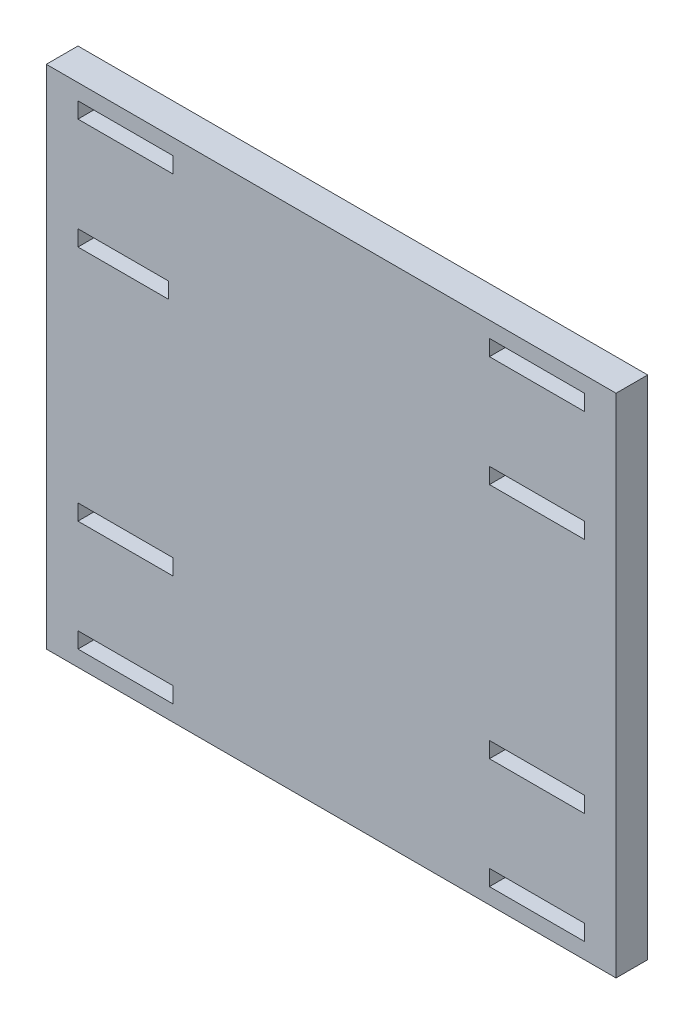
ISO-10303-21;
HEADER;
FILE_DESCRIPTION(('STEP AP214'),'2;1');
FILE_NAME('part.step','',(''),(''),'','','');
FILE_SCHEMA(('AUTOMOTIVE_DESIGN { 1 0 10303 214 1 1 1 1 }'));
ENDSEC;
DATA;
#1=APPLICATION_CONTEXT('core data for automotive mechanical design processes');
#2=APPLICATION_PROTOCOL_DEFINITION('international standard','automotive_design',2000,#1);
#3=PRODUCT_CONTEXT('',#1,'mechanical');
#4=PRODUCT('Part','Part','',(#3));
#5=PRODUCT_RELATED_PRODUCT_CATEGORY('part','',(#4));
#6=PRODUCT_DEFINITION_FORMATION('','',#4);
#7=PRODUCT_DEFINITION_CONTEXT('part definition',#1,'design');
#8=PRODUCT_DEFINITION('design','',#6,#7);
#9=PRODUCT_DEFINITION_SHAPE('','',#8);
#10=(LENGTH_UNIT() NAMED_UNIT(*) SI_UNIT(.MILLI.,.METRE.));
#11=(NAMED_UNIT(*) PLANE_ANGLE_UNIT() SI_UNIT($,.RADIAN.));
#12=(NAMED_UNIT(*) SI_UNIT($,.STERADIAN.) SOLID_ANGLE_UNIT());
#13=UNCERTAINTY_MEASURE_WITH_UNIT(LENGTH_MEASURE(1.E-05),#10,'distance_accuracy_value','');
#14=(GEOMETRIC_REPRESENTATION_CONTEXT(3) GLOBAL_UNCERTAINTY_ASSIGNED_CONTEXT((#13)) GLOBAL_UNIT_ASSIGNED_CONTEXT((#10,
#11,#12)) REPRESENTATION_CONTEXT('',''));
#15=CARTESIAN_POINT('',(0.,0.,0.));
#16=DIRECTION('',(0.,0.,1.));
#17=DIRECTION('',(1.,0.,0.));
#18=AXIS2_PLACEMENT_3D('',#15,#16,#17);
#19=CARTESIAN_POINT('',(90.,80.,10.));
#20=DIRECTION('',(-1.,0.,0.));
#21=DIRECTION('',(0.,-1.,0.));
#22=AXIS2_PLACEMENT_3D('',#19,#20,#21);
#23=PLANE('',#22);
#24=DIRECTION('',(0.,1.,0.));
#25=VECTOR('',#24,1.);
#26=CARTESIAN_POINT('',(90.,80.,0.));
#27=LINE('',#26,#25);
#28=CARTESIAN_POINT('',(90.,-80.,0.));
#29=VERTEX_POINT('',#28);
#30=CARTESIAN_POINT('',(90.,80.,0.));
#31=VERTEX_POINT('',#30);
#32=EDGE_CURVE('E617',#29,#31,#27,.T.);
#33=ORIENTED_EDGE('',*,*,#32,.T.);
#34=DIRECTION('',(0.,0.,-1.));
#35=VECTOR('',#34,1.);
#36=CARTESIAN_POINT('',(90.,80.,10.));
#37=LINE('',#36,#35);
#38=CARTESIAN_POINT('',(90.,80.,10.));
#39=VERTEX_POINT('',#38);
#40=EDGE_CURVE('E11',#39,#31,#37,.T.);
#41=ORIENTED_EDGE('',*,*,#40,.F.);
#42=DIRECTION('',(0.,1.,0.));
#43=VECTOR('',#42,1.);
#44=CARTESIAN_POINT('',(90.,80.,10.));
#45=LINE('',#44,#43);
#46=CARTESIAN_POINT('',(90.,-80.,10.));
#47=VERTEX_POINT('',#46);
#48=EDGE_CURVE('E626',#47,#39,#45,.T.);
#49=ORIENTED_EDGE('',*,*,#48,.F.);
#50=DIRECTION('',(0.,0.,-1.));
#51=VECTOR('',#50,1.);
#52=CARTESIAN_POINT('',(90.,-80.,10.));
#53=LINE('',#52,#51);
#54=EDGE_CURVE('E641',#47,#29,#53,.T.);
#55=ORIENTED_EDGE('',*,*,#54,.T.);
#56=EDGE_LOOP('',(#33,#41,#49,#55));
#57=FACE_BOUND('',#56,.T.);
#58=ADVANCED_FACE('F42',(#57),#23,.F.);
#59=CARTESIAN_POINT('',(-90.,80.,10.));
#60=DIRECTION('',(0.,-1.,0.));
#61=DIRECTION('',(0.,0.,-1.));
#62=AXIS2_PLACEMENT_3D('',#59,#60,#61);
#63=PLANE('',#62);
#64=DIRECTION('',(-1.,0.,0.));
#65=VECTOR('',#64,1.);
#66=CARTESIAN_POINT('',(-90.,80.,0.));
#67=LINE('',#66,#65);
#68=CARTESIAN_POINT('',(-90.,80.,0.));
#69=VERTEX_POINT('',#68);
#70=EDGE_CURVE('E650',#31,#69,#67,.T.);
#71=ORIENTED_EDGE('',*,*,#70,.T.);
#72=DIRECTION('',(0.,0.,-1.));
#73=VECTOR('',#72,1.);
#74=CARTESIAN_POINT('',(-90.,80.,10.));
#75=LINE('',#74,#73);
#76=CARTESIAN_POINT('',(-90.,80.,10.));
#77=VERTEX_POINT('',#76);
#78=EDGE_CURVE('E55',#77,#69,#75,.T.);
#79=ORIENTED_EDGE('',*,*,#78,.F.);
#80=DIRECTION('',(-1.,0.,0.));
#81=VECTOR('',#80,1.);
#82=CARTESIAN_POINT('',(-90.,80.,10.));
#83=LINE('',#82,#81);
#84=EDGE_CURVE('E631',#39,#77,#83,.T.);
#85=ORIENTED_EDGE('',*,*,#84,.F.);
#86=ORIENTED_EDGE('',*,*,#40,.T.);
#87=EDGE_LOOP('',(#71,#79,#85,#86));
#88=FACE_BOUND('',#87,.T.);
#89=ADVANCED_FACE('F685',(#88),#63,.F.);
#90=CARTESIAN_POINT('',(-90.,80.,10.));
#91=DIRECTION('',(1.,0.,0.));
#92=DIRECTION('',(0.,0.,-1.));
#93=AXIS2_PLACEMENT_3D('',#90,#91,#92);
#94=PLANE('',#93);
#95=DIRECTION('',(0.,-1.,0.));
#96=VECTOR('',#95,1.);
#97=CARTESIAN_POINT('',(-90.,80.,0.));
#98=LINE('',#97,#96);
#99=CARTESIAN_POINT('',(-90.,-80.,0.));
#100=VERTEX_POINT('',#99);
#101=EDGE_CURVE('E649',#69,#100,#98,.T.);
#102=ORIENTED_EDGE('',*,*,#101,.T.);
#103=DIRECTION('',(0.,0.,-1.));
#104=VECTOR('',#103,1.);
#105=CARTESIAN_POINT('',(-90.,-80.,10.));
#106=LINE('',#105,#104);
#107=CARTESIAN_POINT('',(-90.,-80.,10.));
#108=VERTEX_POINT('',#107);
#109=EDGE_CURVE('E657',#108,#100,#106,.T.);
#110=ORIENTED_EDGE('',*,*,#109,.F.);
#111=DIRECTION('',(0.,-1.,0.));
#112=VECTOR('',#111,1.);
#113=CARTESIAN_POINT('',(-90.,80.,10.));
#114=LINE('',#113,#112);
#115=EDGE_CURVE('E637',#77,#108,#114,.T.);
#116=ORIENTED_EDGE('',*,*,#115,.F.);
#117=ORIENTED_EDGE('',*,*,#78,.T.);
#118=EDGE_LOOP('',(#102,#110,#116,#117));
#119=FACE_BOUND('',#118,.T.);
#120=ADVANCED_FACE('F670',(#119),#94,.F.);
#121=CARTESIAN_POINT('',(-90.,-80.,10.));
#122=DIRECTION('',(0.,1.,0.));
#123=DIRECTION('',(0.,0.,1.));
#124=AXIS2_PLACEMENT_3D('',#121,#122,#123);
#125=PLANE('',#124);
#126=DIRECTION('',(1.,0.,0.));
#127=VECTOR('',#126,1.);
#128=CARTESIAN_POINT('',(-90.,-80.,0.));
#129=LINE('',#128,#127);
#130=EDGE_CURVE('E632',#100,#29,#129,.T.);
#131=ORIENTED_EDGE('',*,*,#130,.T.);
#132=ORIENTED_EDGE('',*,*,#54,.F.);
#133=DIRECTION('',(1.,0.,0.));
#134=VECTOR('',#133,1.);
#135=CARTESIAN_POINT('',(-90.,-80.,10.));
#136=LINE('',#135,#134);
#137=EDGE_CURVE('E639',#108,#47,#136,.T.);
#138=ORIENTED_EDGE('',*,*,#137,.F.);
#139=ORIENTED_EDGE('',*,*,#109,.T.);
#140=EDGE_LOOP('',(#131,#132,#138,#139));
#141=FACE_BOUND('',#140,.T.);
#142=ADVANCED_FACE('F677',(#141),#125,.F.);
#143=CARTESIAN_POINT('',(0.,0.,10.));
#144=DIRECTION('',(0.,0.,1.));
#145=DIRECTION('',(1.,0.,0.));
#146=AXIS2_PLACEMENT_3D('',#143,#144,#145);
#147=PLANE('',#146);
#148=DIRECTION('',(0.,1.,0.));
#149=VECTOR('',#148,1.);
#150=CARTESIAN_POINT('',(-50.,-35.,10.));
#151=LINE('',#150,#149);
#152=CARTESIAN_POINT('',(-50.,-40.,10.));
#153=VERTEX_POINT('',#152);
#154=CARTESIAN_POINT('',(-50.,-35.,10.));
#155=VERTEX_POINT('',#154);
#156=EDGE_CURVE('E56',#153,#155,#151,.T.);
#157=ORIENTED_EDGE('',*,*,#156,.F.);
#158=DIRECTION('',(1.,0.,0.));
#159=VECTOR('',#158,1.);
#160=CARTESIAN_POINT('',(-80.,-40.,10.));
#161=LINE('',#160,#159);
#162=CARTESIAN_POINT('',(-80.,-40.,10.));
#163=VERTEX_POINT('',#162);
#164=EDGE_CURVE('E466',#163,#153,#161,.T.);
#165=ORIENTED_EDGE('',*,*,#164,.F.);
#166=DIRECTION('',(0.,-1.,0.));
#167=VECTOR('',#166,1.);
#168=CARTESIAN_POINT('',(-80.,-35.,10.));
#169=LINE('',#168,#167);
#170=CARTESIAN_POINT('',(-80.,-35.,10.));
#171=VERTEX_POINT('',#170);
#172=EDGE_CURVE('E472',#171,#163,#169,.T.);
#173=ORIENTED_EDGE('',*,*,#172,.F.);
#174=DIRECTION('',(-1.,0.,0.));
#175=VECTOR('',#174,1.);
#176=CARTESIAN_POINT('',(-80.,-35.,10.));
#177=LINE('',#176,#175);
#178=EDGE_CURVE('E480',#155,#171,#177,.T.);
#179=ORIENTED_EDGE('',*,*,#178,.F.);
#180=EDGE_LOOP('',(#157,#165,#173,#179));
#181=FACE_BOUND('',#180,.T.);
#182=DIRECTION('',(0.,1.,0.));
#183=VECTOR('',#182,1.);
#184=CARTESIAN_POINT('',(80.,40.,10.));
#185=LINE('',#184,#183);
#186=CARTESIAN_POINT('',(80.,35.,10.));
#187=VERTEX_POINT('',#186);
#188=CARTESIAN_POINT('',(80.,40.,10.));
#189=VERTEX_POINT('',#188);
#190=EDGE_CURVE('E70',#187,#189,#185,.T.);
#191=ORIENTED_EDGE('',*,*,#190,.F.);
#192=DIRECTION('',(1.,0.,0.));
#193=VECTOR('',#192,1.);
#194=CARTESIAN_POINT('',(50.,35.,10.));
#195=LINE('',#194,#193);
#196=CARTESIAN_POINT('',(50.,35.,10.));
#197=VERTEX_POINT('',#196);
#198=EDGE_CURVE('E426',#197,#187,#195,.T.);
#199=ORIENTED_EDGE('',*,*,#198,.F.);
#200=DIRECTION('',(0.,-1.,0.));
#201=VECTOR('',#200,1.);
#202=CARTESIAN_POINT('',(50.,40.,10.));
#203=LINE('',#202,#201);
#204=CARTESIAN_POINT('',(50.,40.,10.));
#205=VERTEX_POINT('',#204);
#206=EDGE_CURVE('E429',#205,#197,#203,.T.);
#207=ORIENTED_EDGE('',*,*,#206,.F.);
#208=DIRECTION('',(-1.,0.,0.));
#209=VECTOR('',#208,1.);
#210=CARTESIAN_POINT('',(50.,40.,10.));
#211=LINE('',#210,#209);
#212=EDGE_CURVE('E434',#189,#205,#211,.T.);
#213=ORIENTED_EDGE('',*,*,#212,.F.);
#214=EDGE_LOOP('',(#191,#199,#207,#213));
#215=FACE_BOUND('',#214,.T.);
#216=DIRECTION('',(0.,1.,0.));
#217=VECTOR('',#216,1.);
#218=CARTESIAN_POINT('',(-51.4716480601916,40.,10.));
#219=LINE('',#218,#217);
#220=CARTESIAN_POINT('',(-51.4716480601916,35.,10.));
#221=VERTEX_POINT('',#220);
#222=CARTESIAN_POINT('',(-51.4716480601916,40.,10.));
#223=VERTEX_POINT('',#222);
#224=EDGE_CURVE('E512',#221,#223,#219,.T.);
#225=ORIENTED_EDGE('',*,*,#224,.F.);
#226=DIRECTION('',(1.,0.,0.));
#227=VECTOR('',#226,1.);
#228=CARTESIAN_POINT('',(-80.,35.,10.));
#229=LINE('',#228,#227);
#230=CARTESIAN_POINT('',(-80.,35.,10.));
#231=VERTEX_POINT('',#230);
#232=EDGE_CURVE('E557',#231,#221,#229,.T.);
#233=ORIENTED_EDGE('',*,*,#232,.F.);
#234=DIRECTION('',(0.,-1.,0.));
#235=VECTOR('',#234,1.);
#236=CARTESIAN_POINT('',(-80.,40.,10.));
#237=LINE('',#236,#235);
#238=CARTESIAN_POINT('',(-80.,40.,10.));
#239=VERTEX_POINT('',#238);
#240=EDGE_CURVE('E558',#239,#231,#237,.T.);
#241=ORIENTED_EDGE('',*,*,#240,.F.);
#242=DIRECTION('',(-1.,0.,0.));
#243=VECTOR('',#242,1.);
#244=CARTESIAN_POINT('',(-80.,40.,10.));
#245=LINE('',#244,#243);
#246=EDGE_CURVE('E564',#223,#239,#245,.T.);
#247=ORIENTED_EDGE('',*,*,#246,.F.);
#248=EDGE_LOOP('',(#225,#233,#241,#247));
#249=FACE_BOUND('',#248,.T.);
#250=DIRECTION('',(0.,1.,0.));
#251=VECTOR('',#250,1.);
#252=CARTESIAN_POINT('',(80.,75.,10.));
#253=LINE('',#252,#251);
#254=CARTESIAN_POINT('',(80.,70.,10.));
#255=VERTEX_POINT('',#254);
#256=CARTESIAN_POINT('',(80.,75.,10.));
#257=VERTEX_POINT('',#256);
#258=EDGE_CURVE('E524',#255,#257,#253,.T.);
#259=ORIENTED_EDGE('',*,*,#258,.F.);
#260=DIRECTION('',(1.,0.,0.));
#261=VECTOR('',#260,1.);
#262=CARTESIAN_POINT('',(50.,70.,10.));
#263=LINE('',#262,#261);
#264=CARTESIAN_POINT('',(50.,70.,10.));
#265=VERTEX_POINT('',#264);
#266=EDGE_CURVE('E515',#265,#255,#263,.T.);
#267=ORIENTED_EDGE('',*,*,#266,.F.);
#268=DIRECTION('',(0.,-1.,0.));
#269=VECTOR('',#268,1.);
#270=CARTESIAN_POINT('',(50.,75.,10.));
#271=LINE('',#270,#269);
#272=CARTESIAN_POINT('',(50.,75.,10.));
#273=VERTEX_POINT('',#272);
#274=EDGE_CURVE('E517',#273,#265,#271,.T.);
#275=ORIENTED_EDGE('',*,*,#274,.F.);
#276=DIRECTION('',(-1.,0.,0.));
#277=VECTOR('',#276,1.);
#278=CARTESIAN_POINT('',(50.,75.,10.));
#279=LINE('',#278,#277);
#280=EDGE_CURVE('E523',#257,#273,#279,.T.);
#281=ORIENTED_EDGE('',*,*,#280,.F.);
#282=EDGE_LOOP('',(#259,#267,#275,#281));
#283=FACE_BOUND('',#282,.T.);
#284=DIRECTION('',(0.,1.,0.));
#285=VECTOR('',#284,1.);
#286=CARTESIAN_POINT('',(80.,-70.,10.));
#287=LINE('',#286,#285);
#288=CARTESIAN_POINT('',(80.,-75.,10.));
#289=VERTEX_POINT('',#288);
#290=CARTESIAN_POINT('',(80.,-70.,10.));
#291=VERTEX_POINT('',#290);
#292=EDGE_CURVE('E278',#289,#291,#287,.T.);
#293=ORIENTED_EDGE('',*,*,#292,.F.);
#294=DIRECTION('',(1.,0.,0.));
#295=VECTOR('',#294,1.);
#296=CARTESIAN_POINT('',(50.,-75.,10.));
#297=LINE('',#296,#295);
#298=CARTESIAN_POINT('',(50.,-75.,10.));
#299=VERTEX_POINT('',#298);
#300=EDGE_CURVE('E292',#299,#289,#297,.T.);
#301=ORIENTED_EDGE('',*,*,#300,.F.);
#302=DIRECTION('',(0.,-1.,0.));
#303=VECTOR('',#302,1.);
#304=CARTESIAN_POINT('',(50.,-70.,10.));
#305=LINE('',#304,#303);
#306=CARTESIAN_POINT('',(50.,-70.,10.));
#307=VERTEX_POINT('',#306);
#308=EDGE_CURVE('E300',#307,#299,#305,.T.);
#309=ORIENTED_EDGE('',*,*,#308,.F.);
#310=DIRECTION('',(-1.,0.,0.));
#311=VECTOR('',#310,1.);
#312=CARTESIAN_POINT('',(50.,-70.,10.));
#313=LINE('',#312,#311);
#314=EDGE_CURVE('E301',#291,#307,#313,.T.);
#315=ORIENTED_EDGE('',*,*,#314,.F.);
#316=EDGE_LOOP('',(#293,#301,#309,#315));
#317=FACE_BOUND('',#316,.T.);
#318=DIRECTION('',(0.,1.,0.));
#319=VECTOR('',#318,1.);
#320=CARTESIAN_POINT('',(-50.,-70.,10.));
#321=LINE('',#320,#319);
#322=CARTESIAN_POINT('',(-50.,-75.,10.));
#323=VERTEX_POINT('',#322);
#324=CARTESIAN_POINT('',(-50.,-70.,10.));
#325=VERTEX_POINT('',#324);
#326=EDGE_CURVE('E345',#323,#325,#321,.T.);
#327=ORIENTED_EDGE('',*,*,#326,.F.);
#328=DIRECTION('',(1.,0.,0.));
#329=VECTOR('',#328,1.);
#330=CARTESIAN_POINT('',(-80.,-75.,10.));
#331=LINE('',#330,#329);
#332=CARTESIAN_POINT('',(-80.,-75.,10.));
#333=VERTEX_POINT('',#332);
#334=EDGE_CURVE('E383',#333,#323,#331,.T.);
#335=ORIENTED_EDGE('',*,*,#334,.F.);
#336=DIRECTION('',(0.,-1.,0.));
#337=VECTOR('',#336,1.);
#338=CARTESIAN_POINT('',(-80.,-70.,10.));
#339=LINE('',#338,#337);
#340=CARTESIAN_POINT('',(-80.,-70.,10.));
#341=VERTEX_POINT('',#340);
#342=EDGE_CURVE('E389',#341,#333,#339,.T.);
#343=ORIENTED_EDGE('',*,*,#342,.F.);
#344=DIRECTION('',(-1.,0.,0.));
#345=VECTOR('',#344,1.);
#346=CARTESIAN_POINT('',(-80.,-70.,10.));
#347=LINE('',#346,#345);
#348=EDGE_CURVE('E394',#325,#341,#347,.T.);
#349=ORIENTED_EDGE('',*,*,#348,.F.);
#350=EDGE_LOOP('',(#327,#335,#343,#349));
#351=FACE_BOUND('',#350,.T.);
#352=DIRECTION('',(0.,1.,0.));
#353=VECTOR('',#352,1.);
#354=CARTESIAN_POINT('',(80.,-35.,10.));
#355=LINE('',#354,#353);
#356=CARTESIAN_POINT('',(80.,-40.,10.));
#357=VERTEX_POINT('',#356);
#358=CARTESIAN_POINT('',(80.,-35.,10.));
#359=VERTEX_POINT('',#358);
#360=EDGE_CURVE('E358',#357,#359,#355,.T.);
#361=ORIENTED_EDGE('',*,*,#360,.F.);
#362=DIRECTION('',(1.,0.,0.));
#363=VECTOR('',#362,1.);
#364=CARTESIAN_POINT('',(50.,-40.,10.));
#365=LINE('',#364,#363);
#366=CARTESIAN_POINT('',(50.,-40.,10.));
#367=VERTEX_POINT('',#366);
#368=EDGE_CURVE('E341',#367,#357,#365,.T.);
#369=ORIENTED_EDGE('',*,*,#368,.F.);
#370=DIRECTION('',(0.,-1.,0.));
#371=VECTOR('',#370,1.);
#372=CARTESIAN_POINT('',(50.,-35.,10.));
#373=LINE('',#372,#371);
#374=CARTESIAN_POINT('',(50.,-35.,10.));
#375=VERTEX_POINT('',#374);
#376=EDGE_CURVE('E350',#375,#367,#373,.T.);
#377=ORIENTED_EDGE('',*,*,#376,.F.);
#378=DIRECTION('',(-1.,0.,0.));
#379=VECTOR('',#378,1.);
#380=CARTESIAN_POINT('',(50.,-35.,10.));
#381=LINE('',#380,#379);
#382=EDGE_CURVE('E355',#359,#375,#381,.T.);
#383=ORIENTED_EDGE('',*,*,#382,.F.);
#384=EDGE_LOOP('',(#361,#369,#377,#383));
#385=FACE_BOUND('',#384,.T.);
#386=DIRECTION('',(0.,1.,0.));
#387=VECTOR('',#386,1.);
#388=CARTESIAN_POINT('',(-50.,75.,10.));
#389=LINE('',#388,#387);
#390=CARTESIAN_POINT('',(-50.,70.,10.));
#391=VERTEX_POINT('',#390);
#392=CARTESIAN_POINT('',(-50.,75.,10.));
#393=VERTEX_POINT('',#392);
#394=EDGE_CURVE('E526',#391,#393,#389,.T.);
#395=ORIENTED_EDGE('',*,*,#394,.F.);
#396=DIRECTION('',(1.,0.,0.));
#397=VECTOR('',#396,1.);
#398=CARTESIAN_POINT('',(-80.,70.,10.));
#399=LINE('',#398,#397);
#400=CARTESIAN_POINT('',(-80.,70.,10.));
#401=VERTEX_POINT('',#400);
#402=EDGE_CURVE('E587',#401,#391,#399,.T.);
#403=ORIENTED_EDGE('',*,*,#402,.F.);
#404=DIRECTION('',(0.,-1.,0.));
#405=VECTOR('',#404,1.);
#406=CARTESIAN_POINT('',(-80.,75.,10.));
#407=LINE('',#406,#405);
#408=CARTESIAN_POINT('',(-80.,75.,10.));
#409=VERTEX_POINT('',#408);
#410=EDGE_CURVE('E606',#409,#401,#407,.T.);
#411=ORIENTED_EDGE('',*,*,#410,.F.);
#412=DIRECTION('',(-1.,0.,0.));
#413=VECTOR('',#412,1.);
#414=CARTESIAN_POINT('',(-80.,75.,10.));
#415=LINE('',#414,#413);
#416=EDGE_CURVE('E604',#393,#409,#415,.T.);
#417=ORIENTED_EDGE('',*,*,#416,.F.);
#418=EDGE_LOOP('',(#395,#403,#411,#417));
#419=FACE_BOUND('',#418,.T.);
#420=ORIENTED_EDGE('',*,*,#48,.T.);
#421=ORIENTED_EDGE('',*,*,#84,.T.);
#422=ORIENTED_EDGE('',*,*,#115,.T.);
#423=ORIENTED_EDGE('',*,*,#137,.T.);
#424=EDGE_LOOP('',(#420,#421,#422,#423));
#425=FACE_BOUND('',#424,.T.);
#426=ADVANCED_FACE('F298',(#181,#215,#249,#283,#317,#351,#385,#419,#425),#147,.T.);
#427=CARTESIAN_POINT('',(0.,0.,0.));
#428=DIRECTION('',(0.,0.,1.));
#429=DIRECTION('',(1.,0.,0.));
#430=AXIS2_PLACEMENT_3D('',#427,#428,#429);
#431=PLANE('',#430);
#432=DIRECTION('',(1.,0.,0.));
#433=VECTOR('',#432,1.);
#434=CARTESIAN_POINT('',(-80.,-40.,0.));
#435=LINE('',#434,#433);
#436=CARTESIAN_POINT('',(-80.,-40.,0.));
#437=VERTEX_POINT('',#436);
#438=CARTESIAN_POINT('',(-50.,-40.,0.));
#439=VERTEX_POINT('',#438);
#440=EDGE_CURVE('E459',#437,#439,#435,.T.);
#441=ORIENTED_EDGE('',*,*,#440,.T.);
#442=DIRECTION('',(0.,1.,0.));
#443=VECTOR('',#442,1.);
#444=CARTESIAN_POINT('',(-50.,-35.,0.));
#445=LINE('',#444,#443);
#446=CARTESIAN_POINT('',(-50.,-35.,0.));
#447=VERTEX_POINT('',#446);
#448=EDGE_CURVE('E471',#439,#447,#445,.T.);
#449=ORIENTED_EDGE('',*,*,#448,.T.);
#450=DIRECTION('',(-1.,0.,0.));
#451=VECTOR('',#450,1.);
#452=CARTESIAN_POINT('',(-80.,-35.,0.));
#453=LINE('',#452,#451);
#454=CARTESIAN_POINT('',(-80.,-35.,0.));
#455=VERTEX_POINT('',#454);
#456=EDGE_CURVE('E489',#447,#455,#453,.T.);
#457=ORIENTED_EDGE('',*,*,#456,.T.);
#458=DIRECTION('',(0.,-1.,0.));
#459=VECTOR('',#458,1.);
#460=CARTESIAN_POINT('',(-80.,-35.,0.));
#461=LINE('',#460,#459);
#462=EDGE_CURVE('E486',#455,#437,#461,.T.);
#463=ORIENTED_EDGE('',*,*,#462,.T.);
#464=EDGE_LOOP('',(#441,#449,#457,#463));
#465=FACE_BOUND('',#464,.T.);
#466=DIRECTION('',(1.,0.,0.));
#467=VECTOR('',#466,1.);
#468=CARTESIAN_POINT('',(50.,35.,0.));
#469=LINE('',#468,#467);
#470=CARTESIAN_POINT('',(50.,35.,0.));
#471=VERTEX_POINT('',#470);
#472=CARTESIAN_POINT('',(80.,35.,0.));
#473=VERTEX_POINT('',#472);
#474=EDGE_CURVE('E418',#471,#473,#469,.T.);
#475=ORIENTED_EDGE('',*,*,#474,.T.);
#476=DIRECTION('',(0.,1.,0.));
#477=VECTOR('',#476,1.);
#478=CARTESIAN_POINT('',(80.,40.,0.));
#479=LINE('',#478,#477);
#480=CARTESIAN_POINT('',(80.,40.,0.));
#481=VERTEX_POINT('',#480);
#482=EDGE_CURVE('E431',#473,#481,#479,.T.);
#483=ORIENTED_EDGE('',*,*,#482,.T.);
#484=DIRECTION('',(-1.,0.,0.));
#485=VECTOR('',#484,1.);
#486=CARTESIAN_POINT('',(50.,40.,0.));
#487=LINE('',#486,#485);
#488=CARTESIAN_POINT('',(50.,40.,0.));
#489=VERTEX_POINT('',#488);
#490=EDGE_CURVE('E446',#481,#489,#487,.T.);
#491=ORIENTED_EDGE('',*,*,#490,.T.);
#492=DIRECTION('',(0.,-1.,0.));
#493=VECTOR('',#492,1.);
#494=CARTESIAN_POINT('',(50.,40.,0.));
#495=LINE('',#494,#493);
#496=EDGE_CURVE('E443',#489,#471,#495,.T.);
#497=ORIENTED_EDGE('',*,*,#496,.T.);
#498=EDGE_LOOP('',(#475,#483,#491,#497));
#499=FACE_BOUND('',#498,.T.);
#500=DIRECTION('',(1.,0.,0.));
#501=VECTOR('',#500,1.);
#502=CARTESIAN_POINT('',(-80.,35.,0.));
#503=LINE('',#502,#501);
#504=CARTESIAN_POINT('',(-80.,35.,0.));
#505=VERTEX_POINT('',#504);
#506=CARTESIAN_POINT('',(-51.4716480601916,35.,0.));
#507=VERTEX_POINT('',#506);
#508=EDGE_CURVE('E550',#505,#507,#503,.T.);
#509=ORIENTED_EDGE('',*,*,#508,.T.);
#510=DIRECTION('',(0.,1.,0.));
#511=VECTOR('',#510,1.);
#512=CARTESIAN_POINT('',(-51.4716480601916,40.,0.));
#513=LINE('',#512,#511);
#514=CARTESIAN_POINT('',(-51.4716480601916,40.,0.));
#515=VERTEX_POINT('',#514);
#516=EDGE_CURVE('E563',#507,#515,#513,.T.);
#517=ORIENTED_EDGE('',*,*,#516,.T.);
#518=DIRECTION('',(-1.,0.,0.));
#519=VECTOR('',#518,1.);
#520=CARTESIAN_POINT('',(-80.,40.,0.));
#521=LINE('',#520,#519);
#522=CARTESIAN_POINT('',(-80.,40.,0.));
#523=VERTEX_POINT('',#522);
#524=EDGE_CURVE('E576',#515,#523,#521,.T.);
#525=ORIENTED_EDGE('',*,*,#524,.T.);
#526=DIRECTION('',(0.,-1.,0.));
#527=VECTOR('',#526,1.);
#528=CARTESIAN_POINT('',(-80.,40.,0.));
#529=LINE('',#528,#527);
#530=EDGE_CURVE('E571',#523,#505,#529,.T.);
#531=ORIENTED_EDGE('',*,*,#530,.T.);
#532=EDGE_LOOP('',(#509,#517,#525,#531));
#533=FACE_BOUND('',#532,.T.);
#534=DIRECTION('',(1.,0.,0.));
#535=VECTOR('',#534,1.);
#536=CARTESIAN_POINT('',(50.,70.,0.));
#537=LINE('',#536,#535);
#538=CARTESIAN_POINT('',(50.,70.,0.));
#539=VERTEX_POINT('',#538);
#540=CARTESIAN_POINT('',(80.,70.,0.));
#541=VERTEX_POINT('',#540);
#542=EDGE_CURVE('E502',#539,#541,#537,.T.);
#543=ORIENTED_EDGE('',*,*,#542,.T.);
#544=DIRECTION('',(0.,1.,0.));
#545=VECTOR('',#544,1.);
#546=CARTESIAN_POINT('',(80.,75.,0.));
#547=LINE('',#546,#545);
#548=CARTESIAN_POINT('',(80.,75.,0.));
#549=VERTEX_POINT('',#548);
#550=EDGE_CURVE('E520',#541,#549,#547,.T.);
#551=ORIENTED_EDGE('',*,*,#550,.T.);
#552=DIRECTION('',(-1.,0.,0.));
#553=VECTOR('',#552,1.);
#554=CARTESIAN_POINT('',(50.,75.,0.));
#555=LINE('',#554,#553);
#556=CARTESIAN_POINT('',(50.,75.,0.));
#557=VERTEX_POINT('',#556);
#558=EDGE_CURVE('E536',#549,#557,#555,.T.);
#559=ORIENTED_EDGE('',*,*,#558,.T.);
#560=DIRECTION('',(0.,-1.,0.));
#561=VECTOR('',#560,1.);
#562=CARTESIAN_POINT('',(50.,75.,0.));
#563=LINE('',#562,#561);
#564=EDGE_CURVE('E535',#557,#539,#563,.T.);
#565=ORIENTED_EDGE('',*,*,#564,.T.);
#566=EDGE_LOOP('',(#543,#551,#559,#565));
#567=FACE_BOUND('',#566,.T.);
#568=DIRECTION('',(1.,0.,0.));
#569=VECTOR('',#568,1.);
#570=CARTESIAN_POINT('',(50.,-75.,0.));
#571=LINE('',#570,#569);
#572=CARTESIAN_POINT('',(50.,-75.,0.));
#573=VERTEX_POINT('',#572);
#574=CARTESIAN_POINT('',(80.,-75.,0.));
#575=VERTEX_POINT('',#574);
#576=EDGE_CURVE('E314',#573,#575,#571,.T.);
#577=ORIENTED_EDGE('',*,*,#576,.T.);
#578=DIRECTION('',(0.,1.,0.));
#579=VECTOR('',#578,1.);
#580=CARTESIAN_POINT('',(80.,-70.,0.));
#581=LINE('',#580,#579);
#582=CARTESIAN_POINT('',(80.,-70.,0.));
#583=VERTEX_POINT('',#582);
#584=EDGE_CURVE('E284',#575,#583,#581,.T.);
#585=ORIENTED_EDGE('',*,*,#584,.T.);
#586=DIRECTION('',(-1.,0.,0.));
#587=VECTOR('',#586,1.);
#588=CARTESIAN_POINT('',(50.,-70.,0.));
#589=LINE('',#588,#587);
#590=CARTESIAN_POINT('',(50.,-70.,0.));
#591=VERTEX_POINT('',#590);
#592=EDGE_CURVE('E325',#583,#591,#589,.T.);
#593=ORIENTED_EDGE('',*,*,#592,.T.);
#594=DIRECTION('',(0.,-1.,0.));
#595=VECTOR('',#594,1.);
#596=CARTESIAN_POINT('',(50.,-70.,0.));
#597=LINE('',#596,#595);
#598=EDGE_CURVE('E320',#591,#573,#597,.T.);
#599=ORIENTED_EDGE('',*,*,#598,.T.);
#600=EDGE_LOOP('',(#577,#585,#593,#599));
#601=FACE_BOUND('',#600,.T.);
#602=DIRECTION('',(1.,0.,0.));
#603=VECTOR('',#602,1.);
#604=CARTESIAN_POINT('',(-80.,-75.,0.));
#605=LINE('',#604,#603);
#606=CARTESIAN_POINT('',(-80.,-75.,0.));
#607=VERTEX_POINT('',#606);
#608=CARTESIAN_POINT('',(-50.,-75.,0.));
#609=VERTEX_POINT('',#608);
#610=EDGE_CURVE('E378',#607,#609,#605,.T.);
#611=ORIENTED_EDGE('',*,*,#610,.T.);
#612=DIRECTION('',(0.,1.,0.));
#613=VECTOR('',#612,1.);
#614=CARTESIAN_POINT('',(-50.,-70.,0.));
#615=LINE('',#614,#613);
#616=CARTESIAN_POINT('',(-50.,-70.,0.));
#617=VERTEX_POINT('',#616);
#618=EDGE_CURVE('E386',#609,#617,#615,.T.);
#619=ORIENTED_EDGE('',*,*,#618,.T.);
#620=DIRECTION('',(-1.,0.,0.));
#621=VECTOR('',#620,1.);
#622=CARTESIAN_POINT('',(-80.,-70.,0.));
#623=LINE('',#622,#621);
#624=CARTESIAN_POINT('',(-80.,-70.,0.));
#625=VERTEX_POINT('',#624);
#626=EDGE_CURVE('E407',#617,#625,#623,.T.);
#627=ORIENTED_EDGE('',*,*,#626,.T.);
#628=DIRECTION('',(0.,-1.,0.));
#629=VECTOR('',#628,1.);
#630=CARTESIAN_POINT('',(-80.,-70.,0.));
#631=LINE('',#630,#629);
#632=EDGE_CURVE('E405',#625,#607,#631,.T.);
#633=ORIENTED_EDGE('',*,*,#632,.T.);
#634=EDGE_LOOP('',(#611,#619,#627,#633));
#635=FACE_BOUND('',#634,.T.);
#636=DIRECTION('',(1.,0.,0.));
#637=VECTOR('',#636,1.);
#638=CARTESIAN_POINT('',(50.,-40.,0.));
#639=LINE('',#638,#637);
#640=CARTESIAN_POINT('',(50.,-40.,0.));
#641=VERTEX_POINT('',#640);
#642=CARTESIAN_POINT('',(80.,-40.,0.));
#643=VERTEX_POINT('',#642);
#644=EDGE_CURVE('E335',#641,#643,#639,.T.);
#645=ORIENTED_EDGE('',*,*,#644,.T.);
#646=DIRECTION('',(0.,1.,0.));
#647=VECTOR('',#646,1.);
#648=CARTESIAN_POINT('',(80.,-35.,0.));
#649=LINE('',#648,#647);
#650=CARTESIAN_POINT('',(80.,-35.,0.));
#651=VERTEX_POINT('',#650);
#652=EDGE_CURVE('E346',#643,#651,#649,.T.);
#653=ORIENTED_EDGE('',*,*,#652,.T.);
#654=DIRECTION('',(-1.,0.,0.));
#655=VECTOR('',#654,1.);
#656=CARTESIAN_POINT('',(50.,-35.,0.));
#657=LINE('',#656,#655);
#658=CARTESIAN_POINT('',(50.,-35.,0.));
#659=VERTEX_POINT('',#658);
#660=EDGE_CURVE('E370',#651,#659,#657,.T.);
#661=ORIENTED_EDGE('',*,*,#660,.T.);
#662=DIRECTION('',(0.,-1.,0.));
#663=VECTOR('',#662,1.);
#664=CARTESIAN_POINT('',(50.,-35.,0.));
#665=LINE('',#664,#663);
#666=EDGE_CURVE('E361',#659,#641,#665,.T.);
#667=ORIENTED_EDGE('',*,*,#666,.T.);
#668=EDGE_LOOP('',(#645,#653,#661,#667));
#669=FACE_BOUND('',#668,.T.);
#670=DIRECTION('',(1.,0.,0.));
#671=VECTOR('',#670,1.);
#672=CARTESIAN_POINT('',(-80.,70.,0.));
#673=LINE('',#672,#671);
#674=CARTESIAN_POINT('',(-80.,70.,0.));
#675=VERTEX_POINT('',#674);
#676=CARTESIAN_POINT('',(-50.,70.,0.));
#677=VERTEX_POINT('',#676);
#678=EDGE_CURVE('E598',#675,#677,#673,.T.);
#679=ORIENTED_EDGE('',*,*,#678,.T.);
#680=DIRECTION('',(0.,1.,0.));
#681=VECTOR('',#680,1.);
#682=CARTESIAN_POINT('',(-50.,75.,0.));
#683=LINE('',#682,#681);
#684=CARTESIAN_POINT('',(-50.,75.,0.));
#685=VERTEX_POINT('',#684);
#686=EDGE_CURVE('E584',#677,#685,#683,.T.);
#687=ORIENTED_EDGE('',*,*,#686,.T.);
#688=DIRECTION('',(-1.,0.,0.));
#689=VECTOR('',#688,1.);
#690=CARTESIAN_POINT('',(-80.,75.,0.));
#691=LINE('',#690,#689);
#692=CARTESIAN_POINT('',(-80.,75.,0.));
#693=VERTEX_POINT('',#692);
#694=EDGE_CURVE('E589',#685,#693,#691,.T.);
#695=ORIENTED_EDGE('',*,*,#694,.T.);
#696=DIRECTION('',(0.,-1.,0.));
#697=VECTOR('',#696,1.);
#698=CARTESIAN_POINT('',(-80.,75.,0.));
#699=LINE('',#698,#697);
#700=EDGE_CURVE('E592',#693,#675,#699,.T.);
#701=ORIENTED_EDGE('',*,*,#700,.T.);
#702=EDGE_LOOP('',(#679,#687,#695,#701));
#703=FACE_BOUND('',#702,.T.);
#704=ORIENTED_EDGE('',*,*,#32,.F.);
#705=ORIENTED_EDGE('',*,*,#130,.F.);
#706=ORIENTED_EDGE('',*,*,#101,.F.);
#707=ORIENTED_EDGE('',*,*,#70,.F.);
#708=EDGE_LOOP('',(#704,#705,#706,#707));
#709=FACE_BOUND('',#708,.T.);
#710=ADVANCED_FACE('F671',(#465,#499,#533,#567,#601,#635,#669,#703,#709),#431,.F.);
#711=CARTESIAN_POINT('',(-50.,75.,0.));
#712=DIRECTION('',(1.,0.,0.));
#713=DIRECTION('',(0.,0.,-1.));
#714=AXIS2_PLACEMENT_3D('',#711,#712,#713);
#715=PLANE('',#714);
#716=ORIENTED_EDGE('',*,*,#394,.T.);
#717=DIRECTION('',(0.,0.,1.));
#718=VECTOR('',#717,1.);
#719=CARTESIAN_POINT('',(-50.,75.,0.));
#720=LINE('',#719,#718);
#721=EDGE_CURVE('E605',#685,#393,#720,.T.);
#722=ORIENTED_EDGE('',*,*,#721,.F.);
#723=ORIENTED_EDGE('',*,*,#686,.F.);
#724=DIRECTION('',(0.,0.,1.));
#725=VECTOR('',#724,1.);
#726=CARTESIAN_POINT('',(-50.,70.,0.));
#727=LINE('',#726,#725);
#728=EDGE_CURVE('E618',#677,#391,#727,.T.);
#729=ORIENTED_EDGE('',*,*,#728,.T.);
#730=EDGE_LOOP('',(#716,#722,#723,#729));
#731=FACE_BOUND('',#730,.T.);
#732=ADVANCED_FACE('F695',(#731),#715,.F.);
#733=CARTESIAN_POINT('',(-80.,70.,0.));
#734=DIRECTION('',(0.,-1.,0.));
#735=DIRECTION('',(1.,0.,0.));
#736=AXIS2_PLACEMENT_3D('',#733,#734,#735);
#737=PLANE('',#736);
#738=ORIENTED_EDGE('',*,*,#402,.T.);
#739=ORIENTED_EDGE('',*,*,#728,.F.);
#740=ORIENTED_EDGE('',*,*,#678,.F.);
#741=DIRECTION('',(0.,0.,1.));
#742=VECTOR('',#741,1.);
#743=CARTESIAN_POINT('',(-80.,70.,0.));
#744=LINE('',#743,#742);
#745=EDGE_CURVE('E619',#675,#401,#744,.T.);
#746=ORIENTED_EDGE('',*,*,#745,.T.);
#747=EDGE_LOOP('',(#738,#739,#740,#746));
#748=FACE_BOUND('',#747,.T.);
#749=ADVANCED_FACE('F701',(#748),#737,.F.);
#750=CARTESIAN_POINT('',(-80.,75.,0.));
#751=DIRECTION('',(-1.,0.,0.));
#752=DIRECTION('',(0.,0.,1.));
#753=AXIS2_PLACEMENT_3D('',#750,#751,#752);
#754=PLANE('',#753);
#755=ORIENTED_EDGE('',*,*,#410,.T.);
#756=ORIENTED_EDGE('',*,*,#745,.F.);
#757=ORIENTED_EDGE('',*,*,#700,.F.);
#758=DIRECTION('',(0.,0.,1.));
#759=VECTOR('',#758,1.);
#760=CARTESIAN_POINT('',(-80.,75.,0.));
#761=LINE('',#760,#759);
#762=EDGE_CURVE('E621',#693,#409,#761,.T.);
#763=ORIENTED_EDGE('',*,*,#762,.T.);
#764=EDGE_LOOP('',(#755,#756,#757,#763));
#765=FACE_BOUND('',#764,.T.);
#766=ADVANCED_FACE('F710',(#765),#754,.F.);
#767=CARTESIAN_POINT('',(-80.,75.,0.));
#768=DIRECTION('',(0.,1.,0.));
#769=DIRECTION('',(-1.,0.,0.));
#770=AXIS2_PLACEMENT_3D('',#767,#768,#769);
#771=PLANE('',#770);
#772=ORIENTED_EDGE('',*,*,#416,.T.);
#773=ORIENTED_EDGE('',*,*,#762,.F.);
#774=ORIENTED_EDGE('',*,*,#694,.F.);
#775=ORIENTED_EDGE('',*,*,#721,.T.);
#776=EDGE_LOOP('',(#772,#773,#774,#775));
#777=FACE_BOUND('',#776,.T.);
#778=ADVANCED_FACE('F703',(#777),#771,.F.);
#779=CARTESIAN_POINT('',(80.,-35.,0.));
#780=DIRECTION('',(1.,0.,0.));
#781=DIRECTION('',(0.,0.,-1.));
#782=AXIS2_PLACEMENT_3D('',#779,#780,#781);
#783=PLANE('',#782);
#784=ORIENTED_EDGE('',*,*,#360,.T.);
#785=DIRECTION('',(0.,0.,1.));
#786=VECTOR('',#785,1.);
#787=CARTESIAN_POINT('',(80.,-35.,0.));
#788=LINE('',#787,#786);
#789=EDGE_CURVE('E327',#651,#359,#788,.T.);
#790=ORIENTED_EDGE('',*,*,#789,.F.);
#791=ORIENTED_EDGE('',*,*,#652,.F.);
#792=DIRECTION('',(0.,0.,1.));
#793=VECTOR('',#792,1.);
#794=CARTESIAN_POINT('',(80.,-40.,0.));
#795=LINE('',#794,#793);
#796=EDGE_CURVE('E336',#643,#357,#795,.T.);
#797=ORIENTED_EDGE('',*,*,#796,.T.);
#798=EDGE_LOOP('',(#784,#790,#791,#797));
#799=FACE_BOUND('',#798,.T.);
#800=ADVANCED_FACE('F706',(#799),#783,.F.);
#801=CARTESIAN_POINT('',(50.,-40.,0.));
#802=DIRECTION('',(0.,-1.,0.));
#803=DIRECTION('',(0.,0.,-1.));
#804=AXIS2_PLACEMENT_3D('',#801,#802,#803);
#805=PLANE('',#804);
#806=ORIENTED_EDGE('',*,*,#368,.T.);
#807=ORIENTED_EDGE('',*,*,#796,.F.);
#808=ORIENTED_EDGE('',*,*,#644,.F.);
#809=DIRECTION('',(0.,0.,1.));
#810=VECTOR('',#809,1.);
#811=CARTESIAN_POINT('',(50.,-40.,0.));
#812=LINE('',#811,#810);
#813=EDGE_CURVE('E337',#641,#367,#812,.T.);
#814=ORIENTED_EDGE('',*,*,#813,.T.);
#815=EDGE_LOOP('',(#806,#807,#808,#814));
#816=FACE_BOUND('',#815,.T.);
#817=ADVANCED_FACE('F793',(#816),#805,.F.);
#818=CARTESIAN_POINT('',(50.,-35.,0.));
#819=DIRECTION('',(-1.,0.,0.));
#820=DIRECTION('',(0.,0.,1.));
#821=AXIS2_PLACEMENT_3D('',#818,#819,#820);
#822=PLANE('',#821);
#823=ORIENTED_EDGE('',*,*,#376,.T.);
#824=ORIENTED_EDGE('',*,*,#813,.F.);
#825=ORIENTED_EDGE('',*,*,#666,.F.);
#826=DIRECTION('',(0.,0.,1.));
#827=VECTOR('',#826,1.);
#828=CARTESIAN_POINT('',(50.,-35.,0.));
#829=LINE('',#828,#827);
#830=EDGE_CURVE('E334',#659,#375,#829,.T.);
#831=ORIENTED_EDGE('',*,*,#830,.T.);
#832=EDGE_LOOP('',(#823,#824,#825,#831));
#833=FACE_BOUND('',#832,.T.);
#834=ADVANCED_FACE('F796',(#833),#822,.F.);
#835=CARTESIAN_POINT('',(50.,-35.,0.));
#836=DIRECTION('',(0.,1.,0.));
#837=DIRECTION('',(0.,0.,1.));
#838=AXIS2_PLACEMENT_3D('',#835,#836,#837);
#839=PLANE('',#838);
#840=ORIENTED_EDGE('',*,*,#382,.T.);
#841=ORIENTED_EDGE('',*,*,#830,.F.);
#842=ORIENTED_EDGE('',*,*,#660,.F.);
#843=ORIENTED_EDGE('',*,*,#789,.T.);
#844=EDGE_LOOP('',(#840,#841,#842,#843));
#845=FACE_BOUND('',#844,.T.);
#846=ADVANCED_FACE('F794',(#845),#839,.F.);
#847=CARTESIAN_POINT('',(-50.,-70.,0.));
#848=DIRECTION('',(1.,0.,0.));
#849=DIRECTION('',(0.,0.,-1.));
#850=AXIS2_PLACEMENT_3D('',#847,#848,#849);
#851=PLANE('',#850);
#852=ORIENTED_EDGE('',*,*,#326,.T.);
#853=DIRECTION('',(0.,0.,1.));
#854=VECTOR('',#853,1.);
#855=CARTESIAN_POINT('',(-50.,-70.,0.));
#856=LINE('',#855,#854);
#857=EDGE_CURVE('E372',#617,#325,#856,.T.);
#858=ORIENTED_EDGE('',*,*,#857,.F.);
#859=ORIENTED_EDGE('',*,*,#618,.F.);
#860=DIRECTION('',(0.,0.,1.));
#861=VECTOR('',#860,1.);
#862=CARTESIAN_POINT('',(-50.,-75.,0.));
#863=LINE('',#862,#861);
#864=EDGE_CURVE('E304',#609,#323,#863,.T.);
#865=ORIENTED_EDGE('',*,*,#864,.T.);
#866=EDGE_LOOP('',(#852,#858,#859,#865));
#867=FACE_BOUND('',#866,.T.);
#868=ADVANCED_FACE('F785',(#867),#851,.F.);
#869=CARTESIAN_POINT('',(-80.,-75.,0.));
#870=DIRECTION('',(0.,-1.,0.));
#871=DIRECTION('',(0.,0.,-1.));
#872=AXIS2_PLACEMENT_3D('',#869,#870,#871);
#873=PLANE('',#872);
#874=ORIENTED_EDGE('',*,*,#334,.T.);
#875=ORIENTED_EDGE('',*,*,#864,.F.);
#876=ORIENTED_EDGE('',*,*,#610,.F.);
#877=DIRECTION('',(0.,0.,1.));
#878=VECTOR('',#877,1.);
#879=CARTESIAN_POINT('',(-80.,-75.,0.));
#880=LINE('',#879,#878);
#881=EDGE_CURVE('E310',#607,#333,#880,.T.);
#882=ORIENTED_EDGE('',*,*,#881,.T.);
#883=EDGE_LOOP('',(#874,#875,#876,#882));
#884=FACE_BOUND('',#883,.T.);
#885=ADVANCED_FACE('F779',(#884),#873,.F.);
#886=CARTESIAN_POINT('',(-80.,-70.,0.));
#887=DIRECTION('',(-1.,0.,0.));
#888=DIRECTION('',(0.,0.,1.));
#889=AXIS2_PLACEMENT_3D('',#886,#887,#888);
#890=PLANE('',#889);
#891=ORIENTED_EDGE('',*,*,#342,.T.);
#892=ORIENTED_EDGE('',*,*,#881,.F.);
#893=ORIENTED_EDGE('',*,*,#632,.F.);
#894=DIRECTION('',(0.,0.,1.));
#895=VECTOR('',#894,1.);
#896=CARTESIAN_POINT('',(-80.,-70.,0.));
#897=LINE('',#896,#895);
#898=EDGE_CURVE('E377',#625,#341,#897,.T.);
#899=ORIENTED_EDGE('',*,*,#898,.T.);
#900=EDGE_LOOP('',(#891,#892,#893,#899));
#901=FACE_BOUND('',#900,.T.);
#902=ADVANCED_FACE('F783',(#901),#890,.F.);
#903=CARTESIAN_POINT('',(-80.,-70.,0.));
#904=DIRECTION('',(0.,1.,0.));
#905=DIRECTION('',(0.,0.,1.));
#906=AXIS2_PLACEMENT_3D('',#903,#904,#905);
#907=PLANE('',#906);
#908=ORIENTED_EDGE('',*,*,#348,.T.);
#909=ORIENTED_EDGE('',*,*,#898,.F.);
#910=ORIENTED_EDGE('',*,*,#626,.F.);
#911=ORIENTED_EDGE('',*,*,#857,.T.);
#912=EDGE_LOOP('',(#908,#909,#910,#911));
#913=FACE_BOUND('',#912,.T.);
#914=ADVANCED_FACE('F787',(#913),#907,.F.);
#915=CARTESIAN_POINT('',(80.,-70.,0.));
#916=DIRECTION('',(1.,0.,0.));
#917=DIRECTION('',(0.,1.,0.));
#918=AXIS2_PLACEMENT_3D('',#915,#916,#917);
#919=PLANE('',#918);
#920=ORIENTED_EDGE('',*,*,#292,.T.);
#921=DIRECTION('',(0.,0.,1.));
#922=VECTOR('',#921,1.);
#923=CARTESIAN_POINT('',(80.,-70.,0.));
#924=LINE('',#923,#922);
#925=EDGE_CURVE('E318',#583,#291,#924,.T.);
#926=ORIENTED_EDGE('',*,*,#925,.F.);
#927=ORIENTED_EDGE('',*,*,#584,.F.);
#928=DIRECTION('',(0.,0.,1.));
#929=VECTOR('',#928,1.);
#930=CARTESIAN_POINT('',(80.,-75.,0.));
#931=LINE('',#930,#929);
#932=EDGE_CURVE('E277',#575,#289,#931,.T.);
#933=ORIENTED_EDGE('',*,*,#932,.T.);
#934=EDGE_LOOP('',(#920,#926,#927,#933));
#935=FACE_BOUND('',#934,.T.);
#936=ADVANCED_FACE('F279',(#935),#919,.F.);
#937=CARTESIAN_POINT('',(50.,-75.,0.));
#938=DIRECTION('',(0.,-1.,0.));
#939=DIRECTION('',(0.,0.,-1.));
#940=AXIS2_PLACEMENT_3D('',#937,#938,#939);
#941=PLANE('',#940);
#942=ORIENTED_EDGE('',*,*,#300,.T.);
#943=ORIENTED_EDGE('',*,*,#932,.F.);
#944=ORIENTED_EDGE('',*,*,#576,.F.);
#945=DIRECTION('',(0.,0.,1.));
#946=VECTOR('',#945,1.);
#947=CARTESIAN_POINT('',(50.,-75.,0.));
#948=LINE('',#947,#946);
#949=EDGE_CURVE('E286',#573,#299,#948,.T.);
#950=ORIENTED_EDGE('',*,*,#949,.T.);
#951=EDGE_LOOP('',(#942,#943,#944,#950));
#952=FACE_BOUND('',#951,.T.);
#953=ADVANCED_FACE('F295',(#952),#941,.F.);
#954=CARTESIAN_POINT('',(50.,-70.,0.));
#955=DIRECTION('',(-1.,0.,0.));
#956=DIRECTION('',(0.,0.,1.));
#957=AXIS2_PLACEMENT_3D('',#954,#955,#956);
#958=PLANE('',#957);
#959=ORIENTED_EDGE('',*,*,#308,.T.);
#960=ORIENTED_EDGE('',*,*,#949,.F.);
#961=ORIENTED_EDGE('',*,*,#598,.F.);
#962=DIRECTION('',(0.,0.,1.));
#963=VECTOR('',#962,1.);
#964=CARTESIAN_POINT('',(50.,-70.,0.));
#965=LINE('',#964,#963);
#966=EDGE_CURVE('E1050',#591,#307,#965,.T.);
#967=ORIENTED_EDGE('',*,*,#966,.T.);
#968=EDGE_LOOP('',(#959,#960,#961,#967));
#969=FACE_BOUND('',#968,.T.);
#970=ADVANCED_FACE('F811',(#969),#958,.F.);
#971=CARTESIAN_POINT('',(50.,-70.,0.));
#972=DIRECTION('',(0.,1.,0.));
#973=DIRECTION('',(0.,0.,1.));
#974=AXIS2_PLACEMENT_3D('',#971,#972,#973);
#975=PLANE('',#974);
#976=ORIENTED_EDGE('',*,*,#314,.T.);
#977=ORIENTED_EDGE('',*,*,#966,.F.);
#978=ORIENTED_EDGE('',*,*,#592,.F.);
#979=ORIENTED_EDGE('',*,*,#925,.T.);
#980=EDGE_LOOP('',(#976,#977,#978,#979));
#981=FACE_BOUND('',#980,.T.);
#982=ADVANCED_FACE('F747',(#981),#975,.F.);
#983=CARTESIAN_POINT('',(80.,75.,0.));
#984=DIRECTION('',(1.,0.,0.));
#985=DIRECTION('',(0.,1.,0.));
#986=AXIS2_PLACEMENT_3D('',#983,#984,#985);
#987=PLANE('',#986);
#988=ORIENTED_EDGE('',*,*,#258,.T.);
#989=DIRECTION('',(0.,0.,1.));
#990=VECTOR('',#989,1.);
#991=CARTESIAN_POINT('',(80.,75.,0.));
#992=LINE('',#991,#990);
#993=EDGE_CURVE('E500',#549,#257,#992,.T.);
#994=ORIENTED_EDGE('',*,*,#993,.F.);
#995=ORIENTED_EDGE('',*,*,#550,.F.);
#996=DIRECTION('',(0.,0.,1.));
#997=VECTOR('',#996,1.);
#998=CARTESIAN_POINT('',(80.,70.,0.));
#999=LINE('',#998,#997);
#1000=EDGE_CURVE('E506',#541,#255,#999,.T.);
#1001=ORIENTED_EDGE('',*,*,#1000,.T.);
#1002=EDGE_LOOP('',(#988,#994,#995,#1001));
#1003=FACE_BOUND('',#1002,.T.);
#1004=ADVANCED_FACE('F740',(#1003),#987,.F.);
#1005=CARTESIAN_POINT('',(50.,70.,0.));
#1006=DIRECTION('',(0.,-1.,0.));
#1007=DIRECTION('',(0.,0.,-1.));
#1008=AXIS2_PLACEMENT_3D('',#1005,#1006,#1007);
#1009=PLANE('',#1008);
#1010=ORIENTED_EDGE('',*,*,#266,.T.);
#1011=ORIENTED_EDGE('',*,*,#1000,.F.);
#1012=ORIENTED_EDGE('',*,*,#542,.F.);
#1013=DIRECTION('',(0.,0.,1.));
#1014=VECTOR('',#1013,1.);
#1015=CARTESIAN_POINT('',(50.,70.,0.));
#1016=LINE('',#1015,#1014);
#1017=EDGE_CURVE('E503',#539,#265,#1016,.T.);
#1018=ORIENTED_EDGE('',*,*,#1017,.T.);
#1019=EDGE_LOOP('',(#1010,#1011,#1012,#1018));
#1020=FACE_BOUND('',#1019,.T.);
#1021=ADVANCED_FACE('F731',(#1020),#1009,.F.);
#1022=CARTESIAN_POINT('',(50.,75.,0.));
#1023=DIRECTION('',(-1.,0.,0.));
#1024=DIRECTION('',(0.,0.,1.));
#1025=AXIS2_PLACEMENT_3D('',#1022,#1023,#1024);
#1026=PLANE('',#1025);
#1027=ORIENTED_EDGE('',*,*,#274,.T.);
#1028=ORIENTED_EDGE('',*,*,#1017,.F.);
#1029=ORIENTED_EDGE('',*,*,#564,.F.);
#1030=DIRECTION('',(0.,0.,1.));
#1031=VECTOR('',#1030,1.);
#1032=CARTESIAN_POINT('',(50.,75.,0.));
#1033=LINE('',#1032,#1031);
#1034=EDGE_CURVE('E505',#557,#273,#1033,.T.);
#1035=ORIENTED_EDGE('',*,*,#1034,.T.);
#1036=EDGE_LOOP('',(#1027,#1028,#1029,#1035));
#1037=FACE_BOUND('',#1036,.T.);
#1038=ADVANCED_FACE('F737',(#1037),#1026,.F.);
#1039=CARTESIAN_POINT('',(50.,75.,0.));
#1040=DIRECTION('',(0.,1.,0.));
#1041=DIRECTION('',(0.,0.,1.));
#1042=AXIS2_PLACEMENT_3D('',#1039,#1040,#1041);
#1043=PLANE('',#1042);
#1044=ORIENTED_EDGE('',*,*,#280,.T.);
#1045=ORIENTED_EDGE('',*,*,#1034,.F.);
#1046=ORIENTED_EDGE('',*,*,#558,.F.);
#1047=ORIENTED_EDGE('',*,*,#993,.T.);
#1048=EDGE_LOOP('',(#1044,#1045,#1046,#1047));
#1049=FACE_BOUND('',#1048,.T.);
#1050=ADVANCED_FACE('F732',(#1049),#1043,.F.);
#1051=CARTESIAN_POINT('',(-51.4716480601916,40.,0.));
#1052=DIRECTION('',(1.,0.,0.));
#1053=DIRECTION('',(0.,1.,0.));
#1054=AXIS2_PLACEMENT_3D('',#1051,#1052,#1053);
#1055=PLANE('',#1054);
#1056=ORIENTED_EDGE('',*,*,#224,.T.);
#1057=DIRECTION('',(0.,0.,1.));
#1058=VECTOR('',#1057,1.);
#1059=CARTESIAN_POINT('',(-51.4716480601916,40.,0.));
#1060=LINE('',#1059,#1058);
#1061=EDGE_CURVE('E543',#515,#223,#1060,.T.);
#1062=ORIENTED_EDGE('',*,*,#1061,.F.);
#1063=ORIENTED_EDGE('',*,*,#516,.F.);
#1064=DIRECTION('',(0.,0.,1.));
#1065=VECTOR('',#1064,1.);
#1066=CARTESIAN_POINT('',(-51.4716480601916,35.,0.));
#1067=LINE('',#1066,#1065);
#1068=EDGE_CURVE('E442',#507,#221,#1067,.T.);
#1069=ORIENTED_EDGE('',*,*,#1068,.T.);
#1070=EDGE_LOOP('',(#1056,#1062,#1063,#1069));
#1071=FACE_BOUND('',#1070,.T.);
#1072=ADVANCED_FACE('F716',(#1071),#1055,.F.);
#1073=CARTESIAN_POINT('',(-80.,35.,0.));
#1074=DIRECTION('',(0.,-1.,0.));
#1075=DIRECTION('',(0.,0.,-1.));
#1076=AXIS2_PLACEMENT_3D('',#1073,#1074,#1075);
#1077=PLANE('',#1076);
#1078=ORIENTED_EDGE('',*,*,#232,.T.);
#1079=ORIENTED_EDGE('',*,*,#1068,.F.);
#1080=ORIENTED_EDGE('',*,*,#508,.F.);
#1081=DIRECTION('',(0.,0.,1.));
#1082=VECTOR('',#1081,1.);
#1083=CARTESIAN_POINT('',(-80.,35.,0.));
#1084=LINE('',#1083,#1082);
#1085=EDGE_CURVE('E552',#505,#231,#1084,.T.);
#1086=ORIENTED_EDGE('',*,*,#1085,.T.);
#1087=EDGE_LOOP('',(#1078,#1079,#1080,#1086));
#1088=FACE_BOUND('',#1087,.T.);
#1089=ADVANCED_FACE('F714',(#1088),#1077,.F.);
#1090=CARTESIAN_POINT('',(-80.,40.,0.));
#1091=DIRECTION('',(-1.,0.,0.));
#1092=DIRECTION('',(0.,0.,1.));
#1093=AXIS2_PLACEMENT_3D('',#1090,#1091,#1092);
#1094=PLANE('',#1093);
#1095=ORIENTED_EDGE('',*,*,#240,.T.);
#1096=ORIENTED_EDGE('',*,*,#1085,.F.);
#1097=ORIENTED_EDGE('',*,*,#530,.F.);
#1098=DIRECTION('',(0.,0.,1.));
#1099=VECTOR('',#1098,1.);
#1100=CARTESIAN_POINT('',(-80.,40.,0.));
#1101=LINE('',#1100,#1099);
#1102=EDGE_CURVE('E547',#523,#239,#1101,.T.);
#1103=ORIENTED_EDGE('',*,*,#1102,.T.);
#1104=EDGE_LOOP('',(#1095,#1096,#1097,#1103));
#1105=FACE_BOUND('',#1104,.T.);
#1106=ADVANCED_FACE('F719',(#1105),#1094,.F.);
#1107=CARTESIAN_POINT('',(-80.,40.,0.));
#1108=DIRECTION('',(0.,1.,0.));
#1109=DIRECTION('',(0.,0.,1.));
#1110=AXIS2_PLACEMENT_3D('',#1107,#1108,#1109);
#1111=PLANE('',#1110);
#1112=ORIENTED_EDGE('',*,*,#246,.T.);
#1113=ORIENTED_EDGE('',*,*,#1102,.F.);
#1114=ORIENTED_EDGE('',*,*,#524,.F.);
#1115=ORIENTED_EDGE('',*,*,#1061,.T.);
#1116=EDGE_LOOP('',(#1112,#1113,#1114,#1115));
#1117=FACE_BOUND('',#1116,.T.);
#1118=ADVANCED_FACE('F724',(#1117),#1111,.F.);
#1119=CARTESIAN_POINT('',(80.,40.,0.));
#1120=DIRECTION('',(1.,0.,0.));
#1121=DIRECTION('',(0.,0.,-1.));
#1122=AXIS2_PLACEMENT_3D('',#1119,#1120,#1121);
#1123=PLANE('',#1122);
#1124=ORIENTED_EDGE('',*,*,#190,.T.);
#1125=DIRECTION('',(0.,0.,1.));
#1126=VECTOR('',#1125,1.);
#1127=CARTESIAN_POINT('',(80.,40.,0.));
#1128=LINE('',#1127,#1126);
#1129=EDGE_CURVE('E411',#481,#189,#1128,.T.);
#1130=ORIENTED_EDGE('',*,*,#1129,.F.);
#1131=ORIENTED_EDGE('',*,*,#482,.F.);
#1132=DIRECTION('',(0.,0.,1.));
#1133=VECTOR('',#1132,1.);
#1134=CARTESIAN_POINT('',(80.,35.,0.));
#1135=LINE('',#1134,#1133);
#1136=EDGE_CURVE('E421',#473,#187,#1135,.T.);
#1137=ORIENTED_EDGE('',*,*,#1136,.T.);
#1138=EDGE_LOOP('',(#1124,#1130,#1131,#1137));
#1139=FACE_BOUND('',#1138,.T.);
#1140=ADVANCED_FACE('F730',(#1139),#1123,.F.);
#1141=CARTESIAN_POINT('',(50.,35.,0.));
#1142=DIRECTION('',(0.,-1.,0.));
#1143=DIRECTION('',(0.,0.,-1.));
#1144=AXIS2_PLACEMENT_3D('',#1141,#1142,#1143);
#1145=PLANE('',#1144);
#1146=ORIENTED_EDGE('',*,*,#198,.T.);
#1147=ORIENTED_EDGE('',*,*,#1136,.F.);
#1148=ORIENTED_EDGE('',*,*,#474,.F.);
#1149=DIRECTION('',(0.,0.,1.));
#1150=VECTOR('',#1149,1.);
#1151=CARTESIAN_POINT('',(50.,35.,0.));
#1152=LINE('',#1151,#1150);
#1153=EDGE_CURVE('E419',#471,#197,#1152,.T.);
#1154=ORIENTED_EDGE('',*,*,#1153,.T.);
#1155=EDGE_LOOP('',(#1146,#1147,#1148,#1154));
#1156=FACE_BOUND('',#1155,.T.);
#1157=ADVANCED_FACE('F764',(#1156),#1145,.F.);
#1158=CARTESIAN_POINT('',(50.,40.,0.));
#1159=DIRECTION('',(-1.,0.,0.));
#1160=DIRECTION('',(0.,0.,1.));
#1161=AXIS2_PLACEMENT_3D('',#1158,#1159,#1160);
#1162=PLANE('',#1161);
#1163=ORIENTED_EDGE('',*,*,#206,.T.);
#1164=ORIENTED_EDGE('',*,*,#1153,.F.);
#1165=ORIENTED_EDGE('',*,*,#496,.F.);
#1166=DIRECTION('',(0.,0.,1.));
#1167=VECTOR('',#1166,1.);
#1168=CARTESIAN_POINT('',(50.,40.,0.));
#1169=LINE('',#1168,#1167);
#1170=EDGE_CURVE('E417',#489,#205,#1169,.T.);
#1171=ORIENTED_EDGE('',*,*,#1170,.T.);
#1172=EDGE_LOOP('',(#1163,#1164,#1165,#1171));
#1173=FACE_BOUND('',#1172,.T.);
#1174=ADVANCED_FACE('F767',(#1173),#1162,.F.);
#1175=CARTESIAN_POINT('',(50.,40.,0.));
#1176=DIRECTION('',(0.,1.,0.));
#1177=DIRECTION('',(0.,0.,1.));
#1178=AXIS2_PLACEMENT_3D('',#1175,#1176,#1177);
#1179=PLANE('',#1178);
#1180=ORIENTED_EDGE('',*,*,#212,.T.);
#1181=ORIENTED_EDGE('',*,*,#1170,.F.);
#1182=ORIENTED_EDGE('',*,*,#490,.F.);
#1183=ORIENTED_EDGE('',*,*,#1129,.T.);
#1184=EDGE_LOOP('',(#1180,#1181,#1182,#1183));
#1185=FACE_BOUND('',#1184,.T.);
#1186=ADVANCED_FACE('F762',(#1185),#1179,.F.);
#1187=CARTESIAN_POINT('',(-50.,-35.,0.));
#1188=DIRECTION('',(1.,0.,0.));
#1189=DIRECTION('',(0.,1.,0.));
#1190=AXIS2_PLACEMENT_3D('',#1187,#1188,#1189);
#1191=PLANE('',#1190);
#1192=ORIENTED_EDGE('',*,*,#156,.T.);
#1193=DIRECTION('',(0.,0.,1.));
#1194=VECTOR('',#1193,1.);
#1195=CARTESIAN_POINT('',(-50.,-35.,0.));
#1196=LINE('',#1195,#1194);
#1197=EDGE_CURVE('E457',#447,#155,#1196,.T.);
#1198=ORIENTED_EDGE('',*,*,#1197,.F.);
#1199=ORIENTED_EDGE('',*,*,#448,.F.);
#1200=DIRECTION('',(0.,0.,1.));
#1201=VECTOR('',#1200,1.);
#1202=CARTESIAN_POINT('',(-50.,-40.,0.));
#1203=LINE('',#1202,#1201);
#1204=EDGE_CURVE('E357',#439,#153,#1203,.T.);
#1205=ORIENTED_EDGE('',*,*,#1204,.T.);
#1206=EDGE_LOOP('',(#1192,#1198,#1199,#1205));
#1207=FACE_BOUND('',#1206,.T.);
#1208=ADVANCED_FACE('F751',(#1207),#1191,.F.);
#1209=CARTESIAN_POINT('',(-80.,-40.,0.));
#1210=DIRECTION('',(0.,-1.,0.));
#1211=DIRECTION('',(0.,0.,-1.));
#1212=AXIS2_PLACEMENT_3D('',#1209,#1210,#1211);
#1213=PLANE('',#1212);
#1214=ORIENTED_EDGE('',*,*,#164,.T.);
#1215=ORIENTED_EDGE('',*,*,#1204,.F.);
#1216=ORIENTED_EDGE('',*,*,#440,.F.);
#1217=DIRECTION('',(0.,0.,1.));
#1218=VECTOR('',#1217,1.);
#1219=CARTESIAN_POINT('',(-80.,-40.,0.));
#1220=LINE('',#1219,#1218);
#1221=EDGE_CURVE('E464',#437,#163,#1220,.T.);
#1222=ORIENTED_EDGE('',*,*,#1221,.T.);
#1223=EDGE_LOOP('',(#1214,#1215,#1216,#1222));
#1224=FACE_BOUND('',#1223,.T.);
#1225=ADVANCED_FACE('F750',(#1224),#1213,.F.);
#1226=CARTESIAN_POINT('',(-80.,-35.,0.));
#1227=DIRECTION('',(-1.,0.,0.));
#1228=DIRECTION('',(0.,0.,1.));
#1229=AXIS2_PLACEMENT_3D('',#1226,#1227,#1228);
#1230=PLANE('',#1229);
#1231=ORIENTED_EDGE('',*,*,#172,.T.);
#1232=ORIENTED_EDGE('',*,*,#1221,.F.);
#1233=ORIENTED_EDGE('',*,*,#462,.F.);
#1234=DIRECTION('',(0.,0.,1.));
#1235=VECTOR('',#1234,1.);
#1236=CARTESIAN_POINT('',(-80.,-35.,0.));
#1237=LINE('',#1236,#1235);
#1238=EDGE_CURVE('E458',#455,#171,#1237,.T.);
#1239=ORIENTED_EDGE('',*,*,#1238,.T.);
#1240=EDGE_LOOP('',(#1231,#1232,#1233,#1239));
#1241=FACE_BOUND('',#1240,.T.);
#1242=ADVANCED_FACE('F755',(#1241),#1230,.F.);
#1243=CARTESIAN_POINT('',(-80.,-35.,0.));
#1244=DIRECTION('',(0.,1.,0.));
#1245=DIRECTION('',(0.,0.,1.));
#1246=AXIS2_PLACEMENT_3D('',#1243,#1244,#1245);
#1247=PLANE('',#1246);
#1248=ORIENTED_EDGE('',*,*,#178,.T.);
#1249=ORIENTED_EDGE('',*,*,#1238,.F.);
#1250=ORIENTED_EDGE('',*,*,#456,.F.);
#1251=ORIENTED_EDGE('',*,*,#1197,.T.);
#1252=EDGE_LOOP('',(#1248,#1249,#1250,#1251));
#1253=FACE_BOUND('',#1252,.T.);
#1254=ADVANCED_FACE('F760',(#1253),#1247,.F.);
#1255=CLOSED_SHELL('',(#58,#89,#120,#142,#426,#710,#732,#749,#766,#778,#800,#817,#834,#846,#868,
#885,#902,#914,#936,#953,#970,#982,#1004,#1021,#1038,#1050,#1072,#1089,#1106,#1118,#1140,#1157,
#1174,#1186,#1208,#1225,#1242,#1254));
#1256=MANIFOLD_SOLID_BREP('B2',#1255);
#1257=ADVANCED_BREP_SHAPE_REPRESENTATION('',(#18,#1256),#14);
#1258=SHAPE_DEFINITION_REPRESENTATION(#9,#1257);
ENDSEC;
END-ISO-10303-21;
